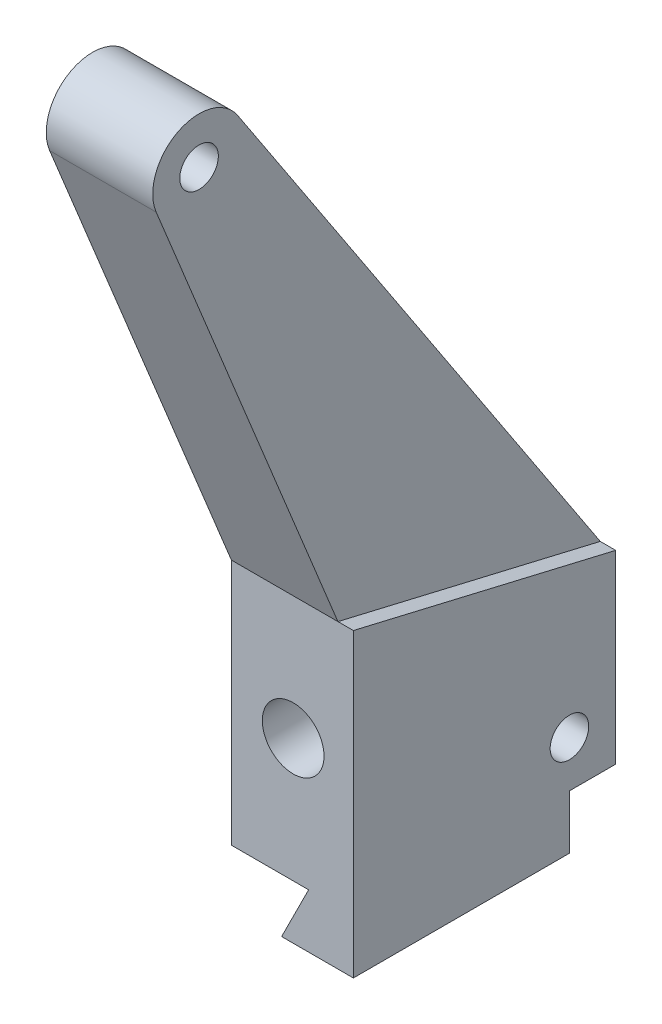
ISO-10303-21;
HEADER;
FILE_DESCRIPTION(('STEP AP214'),'2;1');
FILE_NAME('part.step','',(''),(''),'','','');
FILE_SCHEMA(('AUTOMOTIVE_DESIGN { 1 0 10303 214 1 1 1 1 }'));
ENDSEC;
DATA;
#1=APPLICATION_CONTEXT('core data for automotive mechanical design processes');
#2=APPLICATION_PROTOCOL_DEFINITION('international standard','automotive_design',2000,#1);
#3=PRODUCT_CONTEXT('',#1,'mechanical');
#4=PRODUCT('Part','Part','',(#3));
#5=PRODUCT_RELATED_PRODUCT_CATEGORY('part','',(#4));
#6=PRODUCT_DEFINITION_FORMATION('','',#4);
#7=PRODUCT_DEFINITION_CONTEXT('part definition',#1,'design');
#8=PRODUCT_DEFINITION('design','',#6,#7);
#9=PRODUCT_DEFINITION_SHAPE('','',#8);
#10=(LENGTH_UNIT() NAMED_UNIT(*) SI_UNIT(.MILLI.,.METRE.));
#11=(NAMED_UNIT(*) PLANE_ANGLE_UNIT() SI_UNIT($,.RADIAN.));
#12=(NAMED_UNIT(*) SI_UNIT($,.STERADIAN.) SOLID_ANGLE_UNIT());
#13=UNCERTAINTY_MEASURE_WITH_UNIT(LENGTH_MEASURE(1.E-05),#10,'distance_accuracy_value','');
#14=(GEOMETRIC_REPRESENTATION_CONTEXT(3) GLOBAL_UNCERTAINTY_ASSIGNED_CONTEXT((#13)) GLOBAL_UNIT_ASSIGNED_CONTEXT((#10,
#11,#12)) REPRESENTATION_CONTEXT('',''));
#15=CARTESIAN_POINT('',(0.,0.,0.));
#16=DIRECTION('',(0.,0.,1.));
#17=DIRECTION('',(1.,0.,0.));
#18=AXIS2_PLACEMENT_3D('',#15,#16,#17);
#19=CARTESIAN_POINT('',(8.,0.,0.));
#20=DIRECTION('',(0.,0.,1.));
#21=DIRECTION('',(1.,0.,0.));
#22=AXIS2_PLACEMENT_3D('',#19,#20,#21);
#23=PLANE('',#22);
#24=CARTESIAN_POINT('',(-4.,12.,0.));
#25=DIRECTION('',(0.,0.,-1.));
#26=DIRECTION('',(-1.,0.,0.));
#27=AXIS2_PLACEMENT_3D('',#24,#25,#26);
#28=CIRCLE('',#27,2.);
#29=CARTESIAN_POINT('',(-6.,12.,0.));
#30=VERTEX_POINT('',#29);
#31=EDGE_CURVE('E223',#30,#30,#28,.T.);
#32=ORIENTED_EDGE('',*,*,#31,.F.);
#33=EDGE_LOOP('',(#32));
#34=FACE_BOUND('',#33,.T.);
#35=DIRECTION('',(0.,1.,0.));
#36=VECTOR('',#35,1.);
#37=CARTESIAN_POINT('',(-0.0999999999999994,0.5,0.));
#38=LINE('',#37,#36);
#39=CARTESIAN_POINT('',(-0.0999999999999994,4.,0.));
#40=VERTEX_POINT('',#39);
#41=CARTESIAN_POINT('',(-0.0999999999999994,16.,0.));
#42=VERTEX_POINT('',#41);
#43=EDGE_CURVE('E216',#40,#42,#38,.T.);
#44=ORIENTED_EDGE('',*,*,#43,.F.);
#45=DIRECTION('',(-1.,0.,0.));
#46=VECTOR('',#45,1.);
#47=CARTESIAN_POINT('',(-3.,4.,0.));
#48=LINE('',#47,#46);
#49=CARTESIAN_POINT('',(-8.,4.,0.));
#50=VERTEX_POINT('',#49);
#51=EDGE_CURVE('E231',#40,#50,#48,.T.);
#52=ORIENTED_EDGE('',*,*,#51,.T.);
#53=DIRECTION('',(0.,1.,0.));
#54=VECTOR('',#53,1.);
#55=CARTESIAN_POINT('',(-8.,0.,0.));
#56=LINE('',#55,#54);
#57=CARTESIAN_POINT('',(-8.,16.,0.));
#58=VERTEX_POINT('',#57);
#59=EDGE_CURVE('E141',#50,#58,#56,.T.);
#60=ORIENTED_EDGE('',*,*,#59,.T.);
#61=DIRECTION('',(-1.,0.,0.));
#62=VECTOR('',#61,1.);
#63=CARTESIAN_POINT('',(8.,16.,0.));
#64=LINE('',#63,#62);
#65=CARTESIAN_POINT('',(-1.1,16.,0.));
#66=VERTEX_POINT('',#65);
#67=EDGE_CURVE('E120',#66,#58,#64,.T.);
#68=ORIENTED_EDGE('',*,*,#67,.F.);
#69=EDGE_CURVE('E110',#42,#66,#64,.T.);
#70=ORIENTED_EDGE('',*,*,#69,.F.);
#71=EDGE_LOOP('',(#44,#52,#60,#68,#70));
#72=FACE_BOUND('',#71,.T.);
#73=ADVANCED_FACE('F33',(#34,#72),#23,.F.);
#74=CARTESIAN_POINT('',(8.,20.,17.));
#75=DIRECTION('',(0.,0.,-1.));
#76=DIRECTION('',(0.,1.,0.));
#77=AXIS2_PLACEMENT_3D('',#74,#75,#76);
#78=PLANE('',#77);
#79=CARTESIAN_POINT('',(-4.,12.,17.));
#80=DIRECTION('',(0.,0.,-1.));
#81=DIRECTION('',(-1.,0.,0.));
#82=AXIS2_PLACEMENT_3D('',#79,#80,#81);
#83=CIRCLE('',#82,2.);
#84=CARTESIAN_POINT('',(-6.,12.,17.));
#85=VERTEX_POINT('',#84);
#86=EDGE_CURVE('E222',#85,#85,#83,.T.);
#87=ORIENTED_EDGE('',*,*,#86,.T.);
#88=EDGE_LOOP('',(#87));
#89=FACE_BOUND('',#88,.T.);
#90=DIRECTION('',(0.,-1.,0.));
#91=VECTOR('',#90,1.);
#92=CARTESIAN_POINT('',(-0.0999999999999994,20.,17.));
#93=LINE('',#92,#91);
#94=CARTESIAN_POINT('',(-0.0999999999999994,20.,17.));
#95=VERTEX_POINT('',#94);
#96=CARTESIAN_POINT('',(-0.0999999999999994,0.500000000000001,17.));
#97=VERTEX_POINT('',#96);
#98=EDGE_CURVE('E55',#95,#97,#93,.T.);
#99=ORIENTED_EDGE('',*,*,#98,.F.);
#100=DIRECTION('',(-1.,0.,0.));
#101=VECTOR('',#100,1.);
#102=CARTESIAN_POINT('',(8.,20.,17.));
#103=LINE('',#102,#101);
#104=CARTESIAN_POINT('',(-1.1,20.,17.));
#105=VERTEX_POINT('',#104);
#106=EDGE_CURVE('E190',#95,#105,#103,.T.);
#107=ORIENTED_EDGE('',*,*,#106,.T.);
#108=CARTESIAN_POINT('',(-8.,20.,17.));
#109=VERTEX_POINT('',#108);
#110=EDGE_CURVE('E163',#105,#109,#103,.T.);
#111=ORIENTED_EDGE('',*,*,#110,.T.);
#112=DIRECTION('',(0.,-1.,0.));
#113=VECTOR('',#112,1.);
#114=CARTESIAN_POINT('',(-8.,20.,17.));
#115=LINE('',#114,#113);
#116=CARTESIAN_POINT('',(-8.,4.,17.));
#117=VERTEX_POINT('',#116);
#118=EDGE_CURVE('E179',#109,#117,#115,.T.);
#119=ORIENTED_EDGE('',*,*,#118,.T.);
#120=DIRECTION('',(-1.,0.,0.));
#121=VECTOR('',#120,1.);
#122=CARTESIAN_POINT('',(8.,4.,17.));
#123=LINE('',#122,#121);
#124=CARTESIAN_POINT('',(-3.,4.,17.));
#125=VERTEX_POINT('',#124);
#126=EDGE_CURVE('E168',#125,#117,#123,.T.);
#127=ORIENTED_EDGE('',*,*,#126,.F.);
#128=DIRECTION('',(0.447213595499958,0.894427190999916,0.));
#129=VECTOR('',#128,1.);
#130=CARTESIAN_POINT('',(5.6,21.2,17.));
#131=LINE('',#130,#129);
#132=CARTESIAN_POINT('',(-4.75000000000001,0.49999999999999,17.));
#133=VERTEX_POINT('',#132);
#134=EDGE_CURVE('E154',#133,#125,#131,.T.);
#135=ORIENTED_EDGE('',*,*,#134,.F.);
#136=DIRECTION('',(1.,0.,0.));
#137=VECTOR('',#136,1.);
#138=CARTESIAN_POINT('',(8.,0.5,17.));
#139=LINE('',#138,#137);
#140=EDGE_CURVE('E160',#133,#97,#139,.T.);
#141=ORIENTED_EDGE('',*,*,#140,.T.);
#142=EDGE_LOOP('',(#99,#107,#111,#119,#127,#135,#141));
#143=FACE_BOUND('',#142,.T.);
#144=ADVANCED_FACE('F166',(#89,#143),#78,.F.);
#145=CARTESIAN_POINT('',(8.,16.,0.));
#146=DIRECTION('',(0.,-0.550279315551789,0.834980643413878));
#147=DIRECTION('',(0.,-0.834980643413878,-0.550279315551789));
#148=AXIS2_PLACEMENT_3D('',#145,#146,#147);
#149=PLANE('',#148);
#150=DIRECTION('',(-1.,0.,0.));
#151=VECTOR('',#150,1.);
#152=CARTESIAN_POINT('',(8.,51.6508379466554,23.4950580697584));
#153=LINE('',#152,#151);
#154=CARTESIAN_POINT('',(-1.1,51.6508379466554,23.4950580697584));
#155=VERTEX_POINT('',#154);
#156=CARTESIAN_POINT('',(-8.,51.6508379466554,23.4950580697584));
#157=VERTEX_POINT('',#156);
#158=EDGE_CURVE('E136',#155,#157,#153,.T.);
#159=ORIENTED_EDGE('',*,*,#158,.F.);
#160=DIRECTION('',(0.,0.834980643413878,0.550279315551789));
#161=VECTOR('',#160,1.);
#162=CARTESIAN_POINT('',(-1.1,51.6508379466554,23.4950580697584));
#163=LINE('',#162,#161);
#164=EDGE_CURVE('E125',#66,#155,#163,.T.);
#165=ORIENTED_EDGE('',*,*,#164,.F.);
#166=ORIENTED_EDGE('',*,*,#67,.T.);
#167=DIRECTION('',(0.,0.834980643413878,0.550279315551789));
#168=VECTOR('',#167,1.);
#169=CARTESIAN_POINT('',(-8.,16.,0.));
#170=LINE('',#169,#168);
#171=EDGE_CURVE('E187',#58,#157,#170,.T.);
#172=ORIENTED_EDGE('',*,*,#171,.T.);
#173=EDGE_LOOP('',(#159,#165,#166,#172));
#174=FACE_BOUND('',#173,.T.);
#175=ADVANCED_FACE('F133',(#174),#149,.F.);
#176=CARTESIAN_POINT('',(8.,50.,26.));
#177=DIRECTION('',(-1.,0.,0.));
#178=DIRECTION('',(0.,0.,1.));
#179=AXIS2_PLACEMENT_3D('',#176,#177,#178);
#180=CYLINDRICAL_SURFACE('',#179,3.);
#181=DIRECTION('',(-1.,0.,0.));
#182=VECTOR('',#181,1.);
#183=CARTESIAN_POINT('',(8.,48.8666904256081,28.7776985813064));
#184=LINE('',#183,#182);
#185=CARTESIAN_POINT('',(-1.1,48.8666904256081,28.7776985813064));
#186=VERTEX_POINT('',#185);
#187=CARTESIAN_POINT('',(-8.,48.8666904256081,28.7776985813064));
#188=VERTEX_POINT('',#187);
#189=EDGE_CURVE('E143',#186,#188,#184,.T.);
#190=ORIENTED_EDGE('',*,*,#189,.F.);
#191=CARTESIAN_POINT('',(-1.1,50.,26.));
#192=DIRECTION('',(1.,0.,0.));
#193=DIRECTION('',(0.,0.,1.));
#194=AXIS2_PLACEMENT_3D('',#191,#192,#193);
#195=CIRCLE('',#194,3.);
#196=EDGE_CURVE('E137',#155,#186,#195,.T.);
#197=ORIENTED_EDGE('',*,*,#196,.F.);
#198=ORIENTED_EDGE('',*,*,#158,.T.);
#199=CARTESIAN_POINT('',(-8.,50.,26.));
#200=DIRECTION('',(1.,0.,0.));
#201=DIRECTION('',(0.,0.,-1.));
#202=AXIS2_PLACEMENT_3D('',#199,#200,#201);
#203=CIRCLE('',#202,3.);
#204=EDGE_CURVE('E184',#157,#188,#203,.T.);
#205=ORIENTED_EDGE('',*,*,#204,.T.);
#206=EDGE_LOOP('',(#190,#197,#198,#205));
#207=FACE_BOUND('',#206,.T.);
#208=ADVANCED_FACE('F202',(#207),#180,.T.);
#209=CARTESIAN_POINT('',(8.,20.,17.));
#210=DIRECTION('',(0.,0.37776985813064,-0.925899527102134));
#211=DIRECTION('',(0.,0.925899527102134,0.37776985813064));
#212=AXIS2_PLACEMENT_3D('',#209,#210,#211);
#213=PLANE('',#212);
#214=ORIENTED_EDGE('',*,*,#110,.F.);
#215=DIRECTION('',(0.,-0.925899527102134,-0.37776985813064));
#216=VECTOR('',#215,1.);
#217=CARTESIAN_POINT('',(-1.1,20.,17.));
#218=LINE('',#217,#216);
#219=EDGE_CURVE('E128',#186,#105,#218,.T.);
#220=ORIENTED_EDGE('',*,*,#219,.F.);
#221=ORIENTED_EDGE('',*,*,#189,.T.);
#222=DIRECTION('',(0.,-0.925899527102134,-0.37776985813064));
#223=VECTOR('',#222,1.);
#224=CARTESIAN_POINT('',(-8.,20.,17.));
#225=LINE('',#224,#223);
#226=EDGE_CURVE('E181',#188,#109,#225,.T.);
#227=ORIENTED_EDGE('',*,*,#226,.T.);
#228=EDGE_LOOP('',(#214,#220,#221,#227));
#229=FACE_BOUND('',#228,.T.);
#230=ADVANCED_FACE('F195',(#229),#213,.F.);
#231=CARTESIAN_POINT('',(8.,50.,26.));
#232=DIRECTION('',(-1.,0.,0.));
#233=DIRECTION('',(0.,0.,1.));
#234=AXIS2_PLACEMENT_3D('',#231,#232,#233);
#235=CYLINDRICAL_SURFACE('',#234,1.25);
#236=CARTESIAN_POINT('',(-1.1,50.,26.));
#237=DIRECTION('',(-1.,0.,0.));
#238=DIRECTION('',(0.,0.,1.));
#239=AXIS2_PLACEMENT_3D('',#236,#237,#238);
#240=CIRCLE('',#239,1.25);
#241=CARTESIAN_POINT('',(-1.1,50.,27.25));
#242=VERTEX_POINT('',#241);
#243=EDGE_CURVE('E36',#242,#242,#240,.T.);
#244=ORIENTED_EDGE('',*,*,#243,.F.);
#245=EDGE_LOOP('',(#244));
#246=FACE_BOUND('',#245,.T.);
#247=CARTESIAN_POINT('',(-8.,50.,26.));
#248=DIRECTION('',(1.,0.,0.));
#249=DIRECTION('',(0.,0.,-1.));
#250=AXIS2_PLACEMENT_3D('',#247,#248,#249);
#251=CIRCLE('',#250,1.25);
#252=CARTESIAN_POINT('',(-8.,50.,24.75));
#253=VERTEX_POINT('',#252);
#254=EDGE_CURVE('E171',#253,#253,#251,.T.);
#255=ORIENTED_EDGE('',*,*,#254,.F.);
#256=EDGE_LOOP('',(#255));
#257=FACE_BOUND('',#256,.T.);
#258=ADVANCED_FACE('F275',(#246,#257),#235,.F.);
#259=CARTESIAN_POINT('',(8.,7.,3.));
#260=DIRECTION('',(1.,0.,0.));
#261=DIRECTION('',(0.,0.,-1.));
#262=AXIS2_PLACEMENT_3D('',#259,#260,#261);
#263=CYLINDRICAL_SURFACE('',#262,1.24999999999999);
#264=CARTESIAN_POINT('',(-8.,7.,3.));
#265=DIRECTION('',(-1.,0.,0.));
#266=DIRECTION('',(0.,0.,1.));
#267=AXIS2_PLACEMENT_3D('',#264,#265,#266);
#268=CIRCLE('',#267,1.24999999999999);
#269=CARTESIAN_POINT('',(-8.,7.,4.24999999999999));
#270=VERTEX_POINT('',#269);
#271=EDGE_CURVE('E226',#270,#270,#268,.T.);
#272=ORIENTED_EDGE('',*,*,#271,.T.);
#273=EDGE_LOOP('',(#272));
#274=FACE_BOUND('',#273,.T.);
#275=CARTESIAN_POINT('',(-0.0999999999999994,7.,3.));
#276=DIRECTION('',(1.,0.,0.));
#277=DIRECTION('',(0.,0.,-1.));
#278=AXIS2_PLACEMENT_3D('',#275,#276,#277);
#279=CIRCLE('',#278,1.24999999999999);
#280=CARTESIAN_POINT('',(-0.0999999999999994,7.,1.75000000000001));
#281=VERTEX_POINT('',#280);
#282=EDGE_CURVE('E218',#281,#281,#279,.F.);
#283=ORIENTED_EDGE('',*,*,#282,.F.);
#284=EDGE_LOOP('',(#283));
#285=FACE_BOUND('',#284,.T.);
#286=ADVANCED_FACE('F272',(#274,#285),#263,.F.);
#287=CARTESIAN_POINT('',(0.,0.5,29.));
#288=DIRECTION('',(0.,1.,0.));
#289=DIRECTION('',(-1.,0.,0.));
#290=AXIS2_PLACEMENT_3D('',#287,#288,#289);
#291=PLANE('',#290);
#292=DIRECTION('',(0.,0.,1.));
#293=VECTOR('',#292,1.);
#294=CARTESIAN_POINT('',(-4.75,0.499999999999999,29.));
#295=LINE('',#294,#293);
#296=CARTESIAN_POINT('',(-4.75,0.5,3.));
#297=VERTEX_POINT('',#296);
#298=EDGE_CURVE('E41',#297,#133,#295,.T.);
#299=ORIENTED_EDGE('',*,*,#298,.F.);
#300=DIRECTION('',(-1.,0.,0.));
#301=VECTOR('',#300,1.);
#302=CARTESIAN_POINT('',(-0.0999999999999994,0.5,3.));
#303=LINE('',#302,#301);
#304=CARTESIAN_POINT('',(-0.0999999999999994,0.5,3.));
#305=VERTEX_POINT('',#304);
#306=EDGE_CURVE('E207',#305,#297,#303,.T.);
#307=ORIENTED_EDGE('',*,*,#306,.F.);
#308=DIRECTION('',(0.,0.,-1.));
#309=VECTOR('',#308,1.);
#310=CARTESIAN_POINT('',(-0.0999999999999994,0.5,29.));
#311=LINE('',#310,#309);
#312=EDGE_CURVE('E11',#97,#305,#311,.T.);
#313=ORIENTED_EDGE('',*,*,#312,.F.);
#314=ORIENTED_EDGE('',*,*,#140,.F.);
#315=EDGE_LOOP('',(#299,#307,#313,#314));
#316=FACE_BOUND('',#315,.T.);
#317=ADVANCED_FACE('F161',(#316),#291,.F.);
#318=CARTESIAN_POINT('',(-5.,0.,29.));
#319=DIRECTION('',(-0.894427190999916,0.447213595499958,0.));
#320=DIRECTION('',(-0.447213595499958,-0.894427190999916,0.));
#321=AXIS2_PLACEMENT_3D('',#318,#319,#320);
#322=PLANE('',#321);
#323=DIRECTION('',(0.447213595499957,0.894427190999916,0.));
#324=VECTOR('',#323,1.);
#325=CARTESIAN_POINT('',(-4.75,0.5,3.));
#326=LINE('',#325,#324);
#327=CARTESIAN_POINT('',(-3.,4.,3.));
#328=VERTEX_POINT('',#327);
#329=EDGE_CURVE('E156',#297,#328,#326,.T.);
#330=ORIENTED_EDGE('',*,*,#329,.F.);
#331=ORIENTED_EDGE('',*,*,#298,.T.);
#332=ORIENTED_EDGE('',*,*,#134,.T.);
#333=DIRECTION('',(0.,0.,-1.));
#334=VECTOR('',#333,1.);
#335=CARTESIAN_POINT('',(-3.,4.,29.));
#336=LINE('',#335,#334);
#337=EDGE_CURVE('E169',#125,#328,#336,.T.);
#338=ORIENTED_EDGE('',*,*,#337,.T.);
#339=EDGE_LOOP('',(#330,#331,#332,#338));
#340=FACE_BOUND('',#339,.T.);
#341=ADVANCED_FACE('F151',(#340),#322,.T.);
#342=CARTESIAN_POINT('',(-8.,50.,26.));
#343=DIRECTION('',(-1.,0.,0.));
#344=DIRECTION('',(0.,0.,-1.));
#345=AXIS2_PLACEMENT_3D('',#342,#343,#344);
#346=PLANE('',#345);
#347=ORIENTED_EDGE('',*,*,#271,.F.);
#348=EDGE_LOOP('',(#347));
#349=FACE_BOUND('',#348,.T.);
#350=ORIENTED_EDGE('',*,*,#254,.T.);
#351=EDGE_LOOP('',(#350));
#352=FACE_BOUND('',#351,.T.);
#353=ORIENTED_EDGE('',*,*,#59,.F.);
#354=DIRECTION('',(0.,0.,-1.));
#355=VECTOR('',#354,1.);
#356=CARTESIAN_POINT('',(-8.,4.,29.));
#357=LINE('',#356,#355);
#358=EDGE_CURVE('E173',#117,#50,#357,.T.);
#359=ORIENTED_EDGE('',*,*,#358,.F.);
#360=ORIENTED_EDGE('',*,*,#118,.F.);
#361=ORIENTED_EDGE('',*,*,#226,.F.);
#362=ORIENTED_EDGE('',*,*,#204,.F.);
#363=ORIENTED_EDGE('',*,*,#171,.F.);
#364=EDGE_LOOP('',(#353,#359,#360,#361,#362,#363));
#365=FACE_BOUND('',#364,.T.);
#366=ADVANCED_FACE('F200',(#349,#352,#365),#346,.T.);
#367=CARTESIAN_POINT('',(-3.,4.,29.));
#368=DIRECTION('',(0.,-1.,0.));
#369=DIRECTION('',(0.,0.,-1.));
#370=AXIS2_PLACEMENT_3D('',#367,#368,#369);
#371=PLANE('',#370);
#372=ORIENTED_EDGE('',*,*,#126,.T.);
#373=ORIENTED_EDGE('',*,*,#358,.T.);
#374=ORIENTED_EDGE('',*,*,#51,.F.);
#375=DIRECTION('',(0.,0.,-1.));
#376=VECTOR('',#375,1.);
#377=CARTESIAN_POINT('',(-0.0999999999999994,4.,3.));
#378=LINE('',#377,#376);
#379=CARTESIAN_POINT('',(-0.0999999999999994,4.,3.));
#380=VERTEX_POINT('',#379);
#381=EDGE_CURVE('E213',#380,#40,#378,.T.);
#382=ORIENTED_EDGE('',*,*,#381,.F.);
#383=DIRECTION('',(1.,0.,0.));
#384=VECTOR('',#383,1.);
#385=CARTESIAN_POINT('',(-3.,4.,3.));
#386=LINE('',#385,#384);
#387=EDGE_CURVE('E48',#328,#380,#386,.T.);
#388=ORIENTED_EDGE('',*,*,#387,.F.);
#389=ORIENTED_EDGE('',*,*,#337,.F.);
#390=EDGE_LOOP('',(#372,#373,#374,#382,#388,#389));
#391=FACE_BOUND('',#390,.T.);
#392=ADVANCED_FACE('F233',(#391),#371,.T.);
#393=CARTESIAN_POINT('',(-4.,12.,0.));
#394=DIRECTION('',(0.,0.,1.));
#395=DIRECTION('',(1.,0.,0.));
#396=AXIS2_PLACEMENT_3D('',#393,#394,#395);
#397=CYLINDRICAL_SURFACE('',#396,2.);
#398=ORIENTED_EDGE('',*,*,#31,.T.);
#399=EDGE_LOOP('',(#398));
#400=FACE_BOUND('',#399,.T.);
#401=ORIENTED_EDGE('',*,*,#86,.F.);
#402=EDGE_LOOP('',(#401));
#403=FACE_BOUND('',#402,.T.);
#404=ADVANCED_FACE('F245',(#400,#403),#397,.F.);
#405=CARTESIAN_POINT('',(-0.0999999999999994,0.,0.));
#406=DIRECTION('',(1.,0.,0.));
#407=DIRECTION('',(0.,0.,-1.));
#408=AXIS2_PLACEMENT_3D('',#405,#406,#407);
#409=PLANE('',#408);
#410=DIRECTION('',(0.,-0.229039333725548,-0.973417168333576));
#411=VECTOR('',#410,1.);
#412=CARTESIAN_POINT('',(-0.0999999999999994,16.,0.));
#413=LINE('',#412,#411);
#414=EDGE_CURVE('E115',#95,#42,#413,.T.);
#415=ORIENTED_EDGE('',*,*,#414,.F.);
#416=ORIENTED_EDGE('',*,*,#98,.T.);
#417=ORIENTED_EDGE('',*,*,#312,.T.);
#418=DIRECTION('',(0.,-1.,0.));
#419=VECTOR('',#418,1.);
#420=CARTESIAN_POINT('',(-0.0999999999999994,4.,3.));
#421=LINE('',#420,#419);
#422=EDGE_CURVE('E211',#380,#305,#421,.T.);
#423=ORIENTED_EDGE('',*,*,#422,.F.);
#424=ORIENTED_EDGE('',*,*,#381,.T.);
#425=ORIENTED_EDGE('',*,*,#43,.T.);
#426=EDGE_LOOP('',(#415,#416,#417,#423,#424,#425));
#427=FACE_BOUND('',#426,.T.);
#428=ORIENTED_EDGE('',*,*,#282,.T.);
#429=EDGE_LOOP('',(#428));
#430=FACE_BOUND('',#429,.T.);
#431=ADVANCED_FACE('F234',(#427,#430),#409,.T.);
#432=CARTESIAN_POINT('',(0.,0.,3.));
#433=DIRECTION('',(0.,0.,1.));
#434=DIRECTION('',(1.,0.,0.));
#435=AXIS2_PLACEMENT_3D('',#432,#433,#434);
#436=PLANE('',#435);
#437=ORIENTED_EDGE('',*,*,#306,.T.);
#438=ORIENTED_EDGE('',*,*,#329,.T.);
#439=ORIENTED_EDGE('',*,*,#387,.T.);
#440=ORIENTED_EDGE('',*,*,#422,.T.);
#441=EDGE_LOOP('',(#437,#438,#439,#440));
#442=FACE_BOUND('',#441,.T.);
#443=ADVANCED_FACE('F237',(#442),#436,.F.);
#444=CARTESIAN_POINT('',(-1.1,16.,0.));
#445=DIRECTION('',(0.,-0.973417168333576,0.229039333725548));
#446=DIRECTION('',(0.,-0.229039333725548,-0.973417168333576));
#447=AXIS2_PLACEMENT_3D('',#444,#445,#446);
#448=PLANE('',#447);
#449=ORIENTED_EDGE('',*,*,#414,.T.);
#450=ORIENTED_EDGE('',*,*,#69,.T.);
#451=DIRECTION('',(0.,-0.229039333725548,-0.973417168333576));
#452=VECTOR('',#451,1.);
#453=CARTESIAN_POINT('',(-1.1,16.,0.));
#454=LINE('',#453,#452);
#455=EDGE_CURVE('E113',#105,#66,#454,.T.);
#456=ORIENTED_EDGE('',*,*,#455,.F.);
#457=ORIENTED_EDGE('',*,*,#106,.F.);
#458=EDGE_LOOP('',(#449,#450,#456,#457));
#459=FACE_BOUND('',#458,.T.);
#460=ADVANCED_FACE('F112',(#459),#448,.F.);
#461=CARTESIAN_POINT('',(-1.1,50.,26.));
#462=DIRECTION('',(-1.,0.,0.));
#463=DIRECTION('',(0.,0.,1.));
#464=AXIS2_PLACEMENT_3D('',#461,#462,#463);
#465=PLANE('',#464);
#466=ORIENTED_EDGE('',*,*,#243,.T.);
#467=EDGE_LOOP('',(#466));
#468=FACE_BOUND('',#467,.T.);
#469=ORIENTED_EDGE('',*,*,#455,.T.);
#470=ORIENTED_EDGE('',*,*,#164,.T.);
#471=ORIENTED_EDGE('',*,*,#196,.T.);
#472=ORIENTED_EDGE('',*,*,#219,.T.);
#473=EDGE_LOOP('',(#469,#470,#471,#472));
#474=FACE_BOUND('',#473,.T.);
#475=ADVANCED_FACE('F124',(#468,#474),#465,.F.);
#476=CLOSED_SHELL('',(#73,#144,#175,#208,#230,#258,#286,#317,#341,#366,#392,#404,#431,#443,#460,#475));
#477=MANIFOLD_SOLID_BREP('B2',#476);
#478=ADVANCED_BREP_SHAPE_REPRESENTATION('',(#18,#477),#14);
#479=SHAPE_DEFINITION_REPRESENTATION(#9,#478);
ENDSEC;
END-ISO-10303-21;
